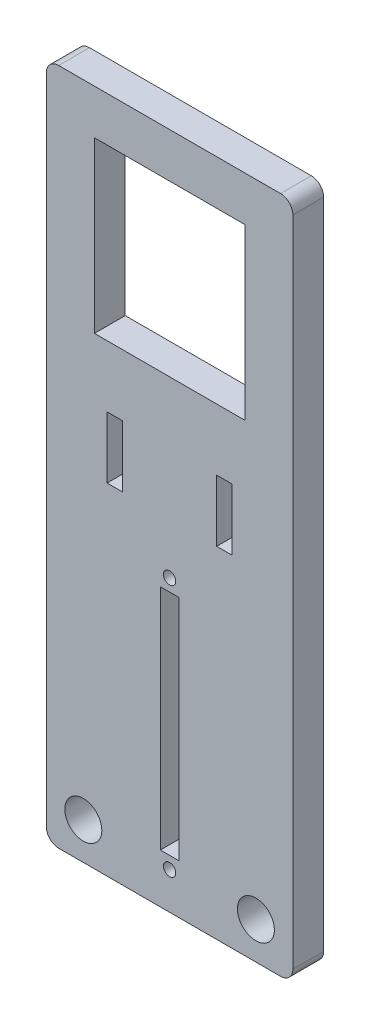
ISO-10303-21;
HEADER;
FILE_DESCRIPTION(('STEP AP214'),'2;1');
FILE_NAME('part.step','',(''),(''),'','','');
FILE_SCHEMA(('AUTOMOTIVE_DESIGN { 1 0 10303 214 1 1 1 1 }'));
ENDSEC;
DATA;
#1=APPLICATION_CONTEXT('core data for automotive mechanical design processes');
#2=APPLICATION_PROTOCOL_DEFINITION('international standard','automotive_design',2000,#1);
#3=PRODUCT_CONTEXT('',#1,'mechanical');
#4=PRODUCT('Part','Part','',(#3));
#5=PRODUCT_RELATED_PRODUCT_CATEGORY('part','',(#4));
#6=PRODUCT_DEFINITION_FORMATION('','',#4);
#7=PRODUCT_DEFINITION_CONTEXT('part definition',#1,'design');
#8=PRODUCT_DEFINITION('design','',#6,#7);
#9=PRODUCT_DEFINITION_SHAPE('','',#8);
#10=(LENGTH_UNIT() NAMED_UNIT(*) SI_UNIT(.MILLI.,.METRE.));
#11=(NAMED_UNIT(*) PLANE_ANGLE_UNIT() SI_UNIT($,.RADIAN.));
#12=(NAMED_UNIT(*) SI_UNIT($,.STERADIAN.) SOLID_ANGLE_UNIT());
#13=UNCERTAINTY_MEASURE_WITH_UNIT(LENGTH_MEASURE(1.E-05),#10,'distance_accuracy_value','');
#14=(GEOMETRIC_REPRESENTATION_CONTEXT(3) GLOBAL_UNCERTAINTY_ASSIGNED_CONTEXT((#13)) GLOBAL_UNIT_ASSIGNED_CONTEXT((#10,
#11,#12)) REPRESENTATION_CONTEXT('',''));
#15=CARTESIAN_POINT('',(0.,0.,0.));
#16=DIRECTION('',(0.,0.,1.));
#17=DIRECTION('',(1.,0.,0.));
#18=AXIS2_PLACEMENT_3D('',#15,#16,#17);
#19=CARTESIAN_POINT('',(0.,0.,5.));
#20=DIRECTION('',(0.,0.,-1.));
#21=DIRECTION('',(-1.,0.,0.));
#22=AXIS2_PLACEMENT_3D('',#19,#20,#21);
#23=PLANE('',#22);
#24=DIRECTION('',(-1.,0.,0.));
#25=VECTOR('',#24,1.);
#26=CARTESIAN_POINT('',(32.2,102.75,5.));
#27=LINE('',#26,#25);
#28=CARTESIAN_POINT('',(32.2,102.75,5.));
#29=VERTEX_POINT('',#28);
#30=CARTESIAN_POINT('',(7.8,102.75,5.));
#31=VERTEX_POINT('',#30);
#32=EDGE_CURVE('E236',#29,#31,#27,.T.);
#33=ORIENTED_EDGE('',*,*,#32,.F.);
#34=DIRECTION('',(0.,1.,0.));
#35=VECTOR('',#34,1.);
#36=CARTESIAN_POINT('',(32.2,75.25,5.));
#37=LINE('',#36,#35);
#38=CARTESIAN_POINT('',(32.2,75.25,5.));
#39=VERTEX_POINT('',#38);
#40=EDGE_CURVE('E244',#39,#29,#37,.T.);
#41=ORIENTED_EDGE('',*,*,#40,.F.);
#42=DIRECTION('',(1.,0.,0.));
#43=VECTOR('',#42,1.);
#44=CARTESIAN_POINT('',(7.8,75.25,5.));
#45=LINE('',#44,#43);
#46=CARTESIAN_POINT('',(7.8,75.25,5.));
#47=VERTEX_POINT('',#46);
#48=EDGE_CURVE('E241',#47,#39,#45,.T.);
#49=ORIENTED_EDGE('',*,*,#48,.F.);
#50=DIRECTION('',(0.,-1.,0.));
#51=VECTOR('',#50,1.);
#52=CARTESIAN_POINT('',(7.8,102.75,5.));
#53=LINE('',#52,#51);
#54=EDGE_CURVE('E238',#31,#47,#53,.T.);
#55=ORIENTED_EDGE('',*,*,#54,.F.);
#56=EDGE_LOOP('',(#33,#41,#49,#55));
#57=FACE_BOUND('',#56,.T.);
#58=DIRECTION('',(0.,-1.,0.));
#59=VECTOR('',#58,1.);
#60=CARTESIAN_POINT('',(9.86,65.25,5.));
#61=LINE('',#60,#59);
#62=CARTESIAN_POINT('',(9.86,65.25,5.));
#63=VERTEX_POINT('',#62);
#64=CARTESIAN_POINT('',(9.86,55.25,5.));
#65=VERTEX_POINT('',#64);
#66=EDGE_CURVE('E298',#63,#65,#61,.T.);
#67=ORIENTED_EDGE('',*,*,#66,.F.);
#68=DIRECTION('',(-1.,0.,0.));
#69=VECTOR('',#68,1.);
#70=CARTESIAN_POINT('',(9.86,65.25,5.));
#71=LINE('',#70,#69);
#72=CARTESIAN_POINT('',(12.36,65.25,5.));
#73=VERTEX_POINT('',#72);
#74=EDGE_CURVE('E306',#73,#63,#71,.T.);
#75=ORIENTED_EDGE('',*,*,#74,.F.);
#76=DIRECTION('',(0.,1.,0.));
#77=VECTOR('',#76,1.);
#78=CARTESIAN_POINT('',(12.36,65.25,5.));
#79=LINE('',#78,#77);
#80=CARTESIAN_POINT('',(12.36,55.25,5.));
#81=VERTEX_POINT('',#80);
#82=EDGE_CURVE('E303',#81,#73,#79,.T.);
#83=ORIENTED_EDGE('',*,*,#82,.F.);
#84=DIRECTION('',(1.,0.,0.));
#85=VECTOR('',#84,1.);
#86=CARTESIAN_POINT('',(9.86,55.25,5.));
#87=LINE('',#86,#85);
#88=EDGE_CURVE('E300',#65,#81,#87,.T.);
#89=ORIENTED_EDGE('',*,*,#88,.F.);
#90=EDGE_LOOP('',(#67,#75,#83,#89));
#91=FACE_BOUND('',#90,.T.);
#92=DIRECTION('',(0.,-1.,0.));
#93=VECTOR('',#92,1.);
#94=CARTESIAN_POINT('',(0.,0.,5.));
#95=LINE('',#94,#93);
#96=CARTESIAN_POINT('',(0.,108.,5.));
#97=VERTEX_POINT('',#96);
#98=CARTESIAN_POINT('',(0.,2.,5.));
#99=VERTEX_POINT('',#98);
#100=EDGE_CURVE('E361',#97,#99,#95,.T.);
#101=ORIENTED_EDGE('',*,*,#100,.T.);
#102=CARTESIAN_POINT('',(2.,2.,5.));
#103=DIRECTION('',(0.,0.,-1.));
#104=DIRECTION('',(-1.,0.,0.));
#105=AXIS2_PLACEMENT_3D('',#102,#103,#104);
#106=CIRCLE('',#105,2.);
#107=CARTESIAN_POINT('',(2.,0.,5.));
#108=VERTEX_POINT('',#107);
#109=EDGE_CURVE('E396',#99,#108,#106,.F.);
#110=ORIENTED_EDGE('',*,*,#109,.T.);
#111=DIRECTION('',(1.,0.,0.));
#112=VECTOR('',#111,1.);
#113=CARTESIAN_POINT('',(40.,0.,5.));
#114=LINE('',#113,#112);
#115=CARTESIAN_POINT('',(38.,0.,5.));
#116=VERTEX_POINT('',#115);
#117=EDGE_CURVE('E353',#108,#116,#114,.T.);
#118=ORIENTED_EDGE('',*,*,#117,.T.);
#119=CARTESIAN_POINT('',(38.,2.,5.));
#120=DIRECTION('',(0.,0.,-1.));
#121=DIRECTION('',(-1.,0.,0.));
#122=AXIS2_PLACEMENT_3D('',#119,#120,#121);
#123=CIRCLE('',#122,2.);
#124=CARTESIAN_POINT('',(40.,2.,5.));
#125=VERTEX_POINT('',#124);
#126=EDGE_CURVE('E394',#116,#125,#123,.F.);
#127=ORIENTED_EDGE('',*,*,#126,.T.);
#128=DIRECTION('',(0.,1.,0.));
#129=VECTOR('',#128,1.);
#130=CARTESIAN_POINT('',(40.,110.,5.));
#131=LINE('',#130,#129);
#132=CARTESIAN_POINT('',(40.,108.,5.));
#133=VERTEX_POINT('',#132);
#134=EDGE_CURVE('E356',#125,#133,#131,.T.);
#135=ORIENTED_EDGE('',*,*,#134,.T.);
#136=CARTESIAN_POINT('',(38.,108.,5.));
#137=DIRECTION('',(0.,0.,-1.));
#138=DIRECTION('',(-1.,0.,0.));
#139=AXIS2_PLACEMENT_3D('',#136,#137,#138);
#140=CIRCLE('',#139,2.);
#141=CARTESIAN_POINT('',(38.,110.,5.));
#142=VERTEX_POINT('',#141);
#143=EDGE_CURVE('E53',#133,#142,#140,.F.);
#144=ORIENTED_EDGE('',*,*,#143,.T.);
#145=DIRECTION('',(-1.,0.,0.));
#146=VECTOR('',#145,1.);
#147=CARTESIAN_POINT('',(0.,110.,5.));
#148=LINE('',#147,#146);
#149=CARTESIAN_POINT('',(1.99999999999997,110.,5.));
#150=VERTEX_POINT('',#149);
#151=EDGE_CURVE('E359',#142,#150,#148,.T.);
#152=ORIENTED_EDGE('',*,*,#151,.T.);
#153=CARTESIAN_POINT('',(1.99999999999997,108.,5.));
#154=DIRECTION('',(0.,0.,-1.));
#155=DIRECTION('',(-1.,0.,0.));
#156=AXIS2_PLACEMENT_3D('',#153,#154,#155);
#157=CIRCLE('',#156,2.);
#158=EDGE_CURVE('E392',#150,#97,#157,.F.);
#159=ORIENTED_EDGE('',*,*,#158,.T.);
#160=EDGE_LOOP('',(#101,#110,#118,#127,#135,#144,#152,#159));
#161=FACE_BOUND('',#160,.T.);
#162=CARTESIAN_POINT('',(34.,6.,5.));
#163=DIRECTION('',(0.,0.,1.));
#164=DIRECTION('',(1.,0.,0.));
#165=AXIS2_PLACEMENT_3D('',#162,#163,#164);
#166=CIRCLE('',#165,3.);
#167=CARTESIAN_POINT('',(37.,6.,5.));
#168=VERTEX_POINT('',#167);
#169=EDGE_CURVE('E347',#168,#168,#166,.T.);
#170=ORIENTED_EDGE('',*,*,#169,.F.);
#171=EDGE_LOOP('',(#170));
#172=FACE_BOUND('',#171,.T.);
#173=CARTESIAN_POINT('',(6.,6.,5.));
#174=DIRECTION('',(0.,0.,1.));
#175=DIRECTION('',(1.,0.,0.));
#176=AXIS2_PLACEMENT_3D('',#173,#174,#175);
#177=CIRCLE('',#176,3.);
#178=CARTESIAN_POINT('',(9.00000000000001,6.,5.));
#179=VERTEX_POINT('',#178);
#180=EDGE_CURVE('E341',#179,#179,#177,.T.);
#181=ORIENTED_EDGE('',*,*,#180,.F.);
#182=EDGE_LOOP('',(#181));
#183=FACE_BOUND('',#182,.T.);
#184=CARTESIAN_POINT('',(20.,6.,5.));
#185=DIRECTION('',(0.,0.,1.));
#186=DIRECTION('',(1.,0.,0.));
#187=AXIS2_PLACEMENT_3D('',#184,#185,#186);
#188=CIRCLE('',#187,1.00000000000003);
#189=CARTESIAN_POINT('',(21.,6.,5.));
#190=VERTEX_POINT('',#189);
#191=EDGE_CURVE('E335',#190,#190,#188,.T.);
#192=ORIENTED_EDGE('',*,*,#191,.F.);
#193=EDGE_LOOP('',(#192));
#194=FACE_BOUND('',#193,.T.);
#195=CARTESIAN_POINT('',(20.,47.,5.));
#196=DIRECTION('',(0.,0.,1.));
#197=DIRECTION('',(1.,0.,0.));
#198=AXIS2_PLACEMENT_3D('',#195,#196,#197);
#199=CIRCLE('',#198,1.00000000000001);
#200=CARTESIAN_POINT('',(21.,47.,5.));
#201=VERTEX_POINT('',#200);
#202=EDGE_CURVE('E329',#201,#201,#199,.T.);
#203=ORIENTED_EDGE('',*,*,#202,.F.);
#204=EDGE_LOOP('',(#203));
#205=FACE_BOUND('',#204,.T.);
#206=DIRECTION('',(-1.,0.,0.));
#207=VECTOR('',#206,1.);
#208=CARTESIAN_POINT('',(21.5,45.,5.));
#209=LINE('',#208,#207);
#210=CARTESIAN_POINT('',(21.5,45.,5.));
#211=VERTEX_POINT('',#210);
#212=CARTESIAN_POINT('',(18.5,45.,5.));
#213=VERTEX_POINT('',#212);
#214=EDGE_CURVE('E267',#211,#213,#209,.T.);
#215=ORIENTED_EDGE('',*,*,#214,.F.);
#216=DIRECTION('',(0.,1.,0.));
#217=VECTOR('',#216,1.);
#218=CARTESIAN_POINT('',(21.5,8.,5.));
#219=LINE('',#218,#217);
#220=CARTESIAN_POINT('',(21.5,8.,5.));
#221=VERTEX_POINT('',#220);
#222=EDGE_CURVE('E275',#221,#211,#219,.T.);
#223=ORIENTED_EDGE('',*,*,#222,.F.);
#224=DIRECTION('',(1.,0.,0.));
#225=VECTOR('',#224,1.);
#226=CARTESIAN_POINT('',(18.5,8.,5.));
#227=LINE('',#226,#225);
#228=CARTESIAN_POINT('',(18.5,8.,5.));
#229=VERTEX_POINT('',#228);
#230=EDGE_CURVE('E272',#229,#221,#227,.T.);
#231=ORIENTED_EDGE('',*,*,#230,.F.);
#232=DIRECTION('',(0.,-1.,0.));
#233=VECTOR('',#232,1.);
#234=CARTESIAN_POINT('',(18.5,45.,5.));
#235=LINE('',#234,#233);
#236=EDGE_CURVE('E269',#213,#229,#235,.T.);
#237=ORIENTED_EDGE('',*,*,#236,.F.);
#238=EDGE_LOOP('',(#215,#223,#231,#237));
#239=FACE_BOUND('',#238,.T.);
#240=DIRECTION('',(0.,-1.,0.));
#241=VECTOR('',#240,1.);
#242=CARTESIAN_POINT('',(27.64,65.25,5.));
#243=LINE('',#242,#241);
#244=CARTESIAN_POINT('',(27.64,65.25,5.));
#245=VERTEX_POINT('',#244);
#246=CARTESIAN_POINT('',(27.64,55.25,5.));
#247=VERTEX_POINT('',#246);
#248=EDGE_CURVE('E195',#245,#247,#243,.T.);
#249=ORIENTED_EDGE('',*,*,#248,.F.);
#250=DIRECTION('',(-1.,0.,0.));
#251=VECTOR('',#250,1.);
#252=CARTESIAN_POINT('',(27.64,65.25,5.));
#253=LINE('',#252,#251);
#254=CARTESIAN_POINT('',(30.14,65.25,5.));
#255=VERTEX_POINT('',#254);
#256=EDGE_CURVE('E220',#255,#245,#253,.T.);
#257=ORIENTED_EDGE('',*,*,#256,.F.);
#258=DIRECTION('',(0.,1.,0.));
#259=VECTOR('',#258,1.);
#260=CARTESIAN_POINT('',(30.14,65.25,5.));
#261=LINE('',#260,#259);
#262=CARTESIAN_POINT('',(30.14,55.25,5.));
#263=VERTEX_POINT('',#262);
#264=EDGE_CURVE('E218',#263,#255,#261,.T.);
#265=ORIENTED_EDGE('',*,*,#264,.F.);
#266=DIRECTION('',(1.,0.,0.));
#267=VECTOR('',#266,1.);
#268=CARTESIAN_POINT('',(27.64,55.25,5.));
#269=LINE('',#268,#267);
#270=EDGE_CURVE('E205',#247,#263,#269,.T.);
#271=ORIENTED_EDGE('',*,*,#270,.F.);
#272=EDGE_LOOP('',(#249,#257,#265,#271));
#273=FACE_BOUND('',#272,.T.);
#274=ADVANCED_FACE('F33',(#57,#91,#161,#172,#183,#194,#205,#239,#273),#23,.F.);
#275=CARTESIAN_POINT('',(0.,0.,0.));
#276=DIRECTION('',(0.,0.,-1.));
#277=DIRECTION('',(-1.,0.,0.));
#278=AXIS2_PLACEMENT_3D('',#275,#276,#277);
#279=PLANE('',#278);
#280=CARTESIAN_POINT('',(20.,6.,0.));
#281=DIRECTION('',(0.,0.,1.));
#282=DIRECTION('',(1.,0.,0.));
#283=AXIS2_PLACEMENT_3D('',#280,#281,#282);
#284=CIRCLE('',#283,1.00000000000003);
#285=CARTESIAN_POINT('',(21.,6.,0.));
#286=VERTEX_POINT('',#285);
#287=EDGE_CURVE('E332',#286,#286,#284,.T.);
#288=ORIENTED_EDGE('',*,*,#287,.T.);
#289=EDGE_LOOP('',(#288));
#290=FACE_BOUND('',#289,.T.);
#291=CARTESIAN_POINT('',(34.,6.,0.));
#292=DIRECTION('',(0.,0.,1.));
#293=DIRECTION('',(1.,0.,0.));
#294=AXIS2_PLACEMENT_3D('',#291,#292,#293);
#295=CIRCLE('',#294,3.);
#296=CARTESIAN_POINT('',(37.,6.,0.));
#297=VERTEX_POINT('',#296);
#298=EDGE_CURVE('E344',#297,#297,#295,.T.);
#299=ORIENTED_EDGE('',*,*,#298,.T.);
#300=EDGE_LOOP('',(#299));
#301=FACE_BOUND('',#300,.T.);
#302=DIRECTION('',(1.,0.,0.));
#303=VECTOR('',#302,1.);
#304=CARTESIAN_POINT('',(40.,0.,0.));
#305=LINE('',#304,#303);
#306=CARTESIAN_POINT('',(2.,0.,0.));
#307=VERTEX_POINT('',#306);
#308=CARTESIAN_POINT('',(38.,0.,0.));
#309=VERTEX_POINT('',#308);
#310=EDGE_CURVE('E350',#307,#309,#305,.T.);
#311=ORIENTED_EDGE('',*,*,#310,.F.);
#312=CARTESIAN_POINT('',(2.,2.,0.));
#313=DIRECTION('',(0.,0.,-1.));
#314=DIRECTION('',(-1.,0.,0.));
#315=AXIS2_PLACEMENT_3D('',#312,#313,#314);
#316=CIRCLE('',#315,2.);
#317=CARTESIAN_POINT('',(0.,2.,0.));
#318=VERTEX_POINT('',#317);
#319=EDGE_CURVE('E384',#307,#318,#316,.T.);
#320=ORIENTED_EDGE('',*,*,#319,.T.);
#321=DIRECTION('',(0.,-1.,0.));
#322=VECTOR('',#321,1.);
#323=CARTESIAN_POINT('',(0.,0.,0.));
#324=LINE('',#323,#322);
#325=CARTESIAN_POINT('',(0.,108.,0.));
#326=VERTEX_POINT('',#325);
#327=EDGE_CURVE('E357',#326,#318,#324,.T.);
#328=ORIENTED_EDGE('',*,*,#327,.F.);
#329=CARTESIAN_POINT('',(1.99999999999997,108.,0.));
#330=DIRECTION('',(0.,0.,-1.));
#331=DIRECTION('',(-1.,0.,0.));
#332=AXIS2_PLACEMENT_3D('',#329,#330,#331);
#333=CIRCLE('',#332,2.);
#334=CARTESIAN_POINT('',(1.99999999999997,110.,0.));
#335=VERTEX_POINT('',#334);
#336=EDGE_CURVE('E380',#326,#335,#333,.T.);
#337=ORIENTED_EDGE('',*,*,#336,.T.);
#338=DIRECTION('',(-1.,0.,0.));
#339=VECTOR('',#338,1.);
#340=CARTESIAN_POINT('',(0.,110.,0.));
#341=LINE('',#340,#339);
#342=CARTESIAN_POINT('',(38.,110.,0.));
#343=VERTEX_POINT('',#342);
#344=EDGE_CURVE('E370',#343,#335,#341,.T.);
#345=ORIENTED_EDGE('',*,*,#344,.F.);
#346=CARTESIAN_POINT('',(38.,108.,0.));
#347=DIRECTION('',(0.,0.,-1.));
#348=DIRECTION('',(-1.,0.,0.));
#349=AXIS2_PLACEMENT_3D('',#346,#347,#348);
#350=CIRCLE('',#349,2.);
#351=CARTESIAN_POINT('',(40.,108.,0.));
#352=VERTEX_POINT('',#351);
#353=EDGE_CURVE('E378',#343,#352,#350,.T.);
#354=ORIENTED_EDGE('',*,*,#353,.T.);
#355=DIRECTION('',(0.,1.,0.));
#356=VECTOR('',#355,1.);
#357=CARTESIAN_POINT('',(40.,110.,0.));
#358=LINE('',#357,#356);
#359=CARTESIAN_POINT('',(40.,2.,0.));
#360=VERTEX_POINT('',#359);
#361=EDGE_CURVE('E367',#360,#352,#358,.T.);
#362=ORIENTED_EDGE('',*,*,#361,.F.);
#363=CARTESIAN_POINT('',(38.,2.,0.));
#364=DIRECTION('',(0.,0.,-1.));
#365=DIRECTION('',(-1.,0.,0.));
#366=AXIS2_PLACEMENT_3D('',#363,#364,#365);
#367=CIRCLE('',#366,2.);
#368=EDGE_CURVE('E382',#360,#309,#367,.T.);
#369=ORIENTED_EDGE('',*,*,#368,.T.);
#370=EDGE_LOOP('',(#311,#320,#328,#337,#345,#354,#362,#369));
#371=FACE_BOUND('',#370,.T.);
#372=CARTESIAN_POINT('',(6.,6.,0.));
#373=DIRECTION('',(0.,0.,1.));
#374=DIRECTION('',(1.,0.,0.));
#375=AXIS2_PLACEMENT_3D('',#372,#373,#374);
#376=CIRCLE('',#375,3.);
#377=CARTESIAN_POINT('',(9.00000000000001,6.,0.));
#378=VERTEX_POINT('',#377);
#379=EDGE_CURVE('E338',#378,#378,#376,.T.);
#380=ORIENTED_EDGE('',*,*,#379,.T.);
#381=EDGE_LOOP('',(#380));
#382=FACE_BOUND('',#381,.T.);
#383=CARTESIAN_POINT('',(20.,47.,0.));
#384=DIRECTION('',(0.,0.,1.));
#385=DIRECTION('',(1.,0.,0.));
#386=AXIS2_PLACEMENT_3D('',#383,#384,#385);
#387=CIRCLE('',#386,1.00000000000001);
#388=CARTESIAN_POINT('',(21.,47.,0.));
#389=VERTEX_POINT('',#388);
#390=EDGE_CURVE('E328',#389,#389,#387,.T.);
#391=ORIENTED_EDGE('',*,*,#390,.T.);
#392=EDGE_LOOP('',(#391));
#393=FACE_BOUND('',#392,.T.);
#394=DIRECTION('',(-1.,0.,0.));
#395=VECTOR('',#394,1.);
#396=CARTESIAN_POINT('',(9.86,65.25,0.));
#397=LINE('',#396,#395);
#398=CARTESIAN_POINT('',(12.36,65.25,0.));
#399=VERTEX_POINT('',#398);
#400=CARTESIAN_POINT('',(9.86,65.25,0.));
#401=VERTEX_POINT('',#400);
#402=EDGE_CURVE('E301',#399,#401,#397,.T.);
#403=ORIENTED_EDGE('',*,*,#402,.T.);
#404=DIRECTION('',(0.,-1.,0.));
#405=VECTOR('',#404,1.);
#406=CARTESIAN_POINT('',(9.86,65.25,0.));
#407=LINE('',#406,#405);
#408=CARTESIAN_POINT('',(9.86,55.25,0.));
#409=VERTEX_POINT('',#408);
#410=EDGE_CURVE('E297',#401,#409,#407,.T.);
#411=ORIENTED_EDGE('',*,*,#410,.T.);
#412=DIRECTION('',(1.,0.,0.));
#413=VECTOR('',#412,1.);
#414=CARTESIAN_POINT('',(9.86,55.25,0.));
#415=LINE('',#414,#413);
#416=CARTESIAN_POINT('',(12.36,55.25,0.));
#417=VERTEX_POINT('',#416);
#418=EDGE_CURVE('E311',#409,#417,#415,.T.);
#419=ORIENTED_EDGE('',*,*,#418,.T.);
#420=DIRECTION('',(0.,1.,0.));
#421=VECTOR('',#420,1.);
#422=CARTESIAN_POINT('',(12.36,65.25,0.));
#423=LINE('',#422,#421);
#424=EDGE_CURVE('E314',#417,#399,#423,.T.);
#425=ORIENTED_EDGE('',*,*,#424,.T.);
#426=EDGE_LOOP('',(#403,#411,#419,#425));
#427=FACE_BOUND('',#426,.T.);
#428=DIRECTION('',(0.,1.,0.));
#429=VECTOR('',#428,1.);
#430=CARTESIAN_POINT('',(21.5,8.,0.));
#431=LINE('',#430,#429);
#432=CARTESIAN_POINT('',(21.5,8.,0.));
#433=VERTEX_POINT('',#432);
#434=CARTESIAN_POINT('',(21.5,45.,0.));
#435=VERTEX_POINT('',#434);
#436=EDGE_CURVE('E270',#433,#435,#431,.T.);
#437=ORIENTED_EDGE('',*,*,#436,.T.);
#438=DIRECTION('',(-1.,0.,0.));
#439=VECTOR('',#438,1.);
#440=CARTESIAN_POINT('',(21.5,45.,0.));
#441=LINE('',#440,#439);
#442=CARTESIAN_POINT('',(18.5,45.,0.));
#443=VERTEX_POINT('',#442);
#444=EDGE_CURVE('E266',#435,#443,#441,.T.);
#445=ORIENTED_EDGE('',*,*,#444,.T.);
#446=DIRECTION('',(0.,-1.,0.));
#447=VECTOR('',#446,1.);
#448=CARTESIAN_POINT('',(18.5,45.,0.));
#449=LINE('',#448,#447);
#450=CARTESIAN_POINT('',(18.5,8.,0.));
#451=VERTEX_POINT('',#450);
#452=EDGE_CURVE('E280',#443,#451,#449,.T.);
#453=ORIENTED_EDGE('',*,*,#452,.T.);
#454=DIRECTION('',(1.,0.,0.));
#455=VECTOR('',#454,1.);
#456=CARTESIAN_POINT('',(18.5,8.,0.));
#457=LINE('',#456,#455);
#458=EDGE_CURVE('E283',#451,#433,#457,.T.);
#459=ORIENTED_EDGE('',*,*,#458,.T.);
#460=EDGE_LOOP('',(#437,#445,#453,#459));
#461=FACE_BOUND('',#460,.T.);
#462=DIRECTION('',(0.,1.,0.));
#463=VECTOR('',#462,1.);
#464=CARTESIAN_POINT('',(32.2,75.25,0.));
#465=LINE('',#464,#463);
#466=CARTESIAN_POINT('',(32.2,75.25,0.));
#467=VERTEX_POINT('',#466);
#468=CARTESIAN_POINT('',(32.2,102.75,0.));
#469=VERTEX_POINT('',#468);
#470=EDGE_CURVE('E239',#467,#469,#465,.T.);
#471=ORIENTED_EDGE('',*,*,#470,.T.);
#472=DIRECTION('',(-1.,0.,0.));
#473=VECTOR('',#472,1.);
#474=CARTESIAN_POINT('',(32.2,102.75,0.));
#475=LINE('',#474,#473);
#476=CARTESIAN_POINT('',(7.8,102.75,0.));
#477=VERTEX_POINT('',#476);
#478=EDGE_CURVE('E213',#469,#477,#475,.T.);
#479=ORIENTED_EDGE('',*,*,#478,.T.);
#480=DIRECTION('',(0.,-1.,0.));
#481=VECTOR('',#480,1.);
#482=CARTESIAN_POINT('',(7.8,102.75,0.));
#483=LINE('',#482,#481);
#484=CARTESIAN_POINT('',(7.8,75.25,0.));
#485=VERTEX_POINT('',#484);
#486=EDGE_CURVE('E249',#477,#485,#483,.T.);
#487=ORIENTED_EDGE('',*,*,#486,.T.);
#488=DIRECTION('',(1.,0.,0.));
#489=VECTOR('',#488,1.);
#490=CARTESIAN_POINT('',(7.8,75.25,0.));
#491=LINE('',#490,#489);
#492=EDGE_CURVE('E252',#485,#467,#491,.T.);
#493=ORIENTED_EDGE('',*,*,#492,.T.);
#494=EDGE_LOOP('',(#471,#479,#487,#493));
#495=FACE_BOUND('',#494,.T.);
#496=DIRECTION('',(-1.,0.,0.));
#497=VECTOR('',#496,1.);
#498=CARTESIAN_POINT('',(27.64,65.25,0.));
#499=LINE('',#498,#497);
#500=CARTESIAN_POINT('',(30.14,65.25,0.));
#501=VERTEX_POINT('',#500);
#502=CARTESIAN_POINT('',(27.64,65.25,0.));
#503=VERTEX_POINT('',#502);
#504=EDGE_CURVE('E206',#501,#503,#499,.T.);
#505=ORIENTED_EDGE('',*,*,#504,.T.);
#506=DIRECTION('',(0.,-1.,0.));
#507=VECTOR('',#506,1.);
#508=CARTESIAN_POINT('',(27.64,65.25,0.));
#509=LINE('',#508,#507);
#510=CARTESIAN_POINT('',(27.64,55.25,0.));
#511=VERTEX_POINT('',#510);
#512=EDGE_CURVE('E224',#503,#511,#509,.T.);
#513=ORIENTED_EDGE('',*,*,#512,.T.);
#514=DIRECTION('',(1.,0.,0.));
#515=VECTOR('',#514,1.);
#516=CARTESIAN_POINT('',(27.64,55.25,0.));
#517=LINE('',#516,#515);
#518=CARTESIAN_POINT('',(30.14,55.25,0.));
#519=VERTEX_POINT('',#518);
#520=EDGE_CURVE('E212',#511,#519,#517,.T.);
#521=ORIENTED_EDGE('',*,*,#520,.T.);
#522=DIRECTION('',(0.,1.,0.));
#523=VECTOR('',#522,1.);
#524=CARTESIAN_POINT('',(30.14,65.25,0.));
#525=LINE('',#524,#523);
#526=EDGE_CURVE('E227',#519,#501,#525,.T.);
#527=ORIENTED_EDGE('',*,*,#526,.T.);
#528=EDGE_LOOP('',(#505,#513,#521,#527));
#529=FACE_BOUND('',#528,.T.);
#530=ADVANCED_FACE('F409',(#290,#301,#371,#382,#393,#427,#461,#495,#529),#279,.T.);
#531=CARTESIAN_POINT('',(40.,0.,5.));
#532=DIRECTION('',(0.,1.,0.));
#533=DIRECTION('',(-1.,0.,0.));
#534=AXIS2_PLACEMENT_3D('',#531,#532,#533);
#535=PLANE('',#534);
#536=ORIENTED_EDGE('',*,*,#117,.F.);
#537=DIRECTION('',(0.,0.,-1.));
#538=VECTOR('',#537,1.);
#539=CARTESIAN_POINT('',(2.,0.,5.));
#540=LINE('',#539,#538);
#541=EDGE_CURVE('E375',#108,#307,#540,.T.);
#542=ORIENTED_EDGE('',*,*,#541,.T.);
#543=ORIENTED_EDGE('',*,*,#310,.T.);
#544=DIRECTION('',(0.,0.,-1.));
#545=VECTOR('',#544,1.);
#546=CARTESIAN_POINT('',(38.,0.,5.));
#547=LINE('',#546,#545);
#548=EDGE_CURVE('E364',#309,#116,#547,.F.);
#549=ORIENTED_EDGE('',*,*,#548,.T.);
#550=EDGE_LOOP('',(#536,#542,#543,#549));
#551=FACE_BOUND('',#550,.T.);
#552=ADVANCED_FACE('F428',(#551),#535,.F.);
#553=CARTESIAN_POINT('',(40.,110.,5.));
#554=DIRECTION('',(-1.,0.,0.));
#555=DIRECTION('',(0.,-1.,0.));
#556=AXIS2_PLACEMENT_3D('',#553,#554,#555);
#557=PLANE('',#556);
#558=ORIENTED_EDGE('',*,*,#134,.F.);
#559=DIRECTION('',(0.,0.,-1.));
#560=VECTOR('',#559,1.);
#561=CARTESIAN_POINT('',(40.,2.,5.));
#562=LINE('',#561,#560);
#563=EDGE_CURVE('E400',#125,#360,#562,.T.);
#564=ORIENTED_EDGE('',*,*,#563,.T.);
#565=ORIENTED_EDGE('',*,*,#361,.T.);
#566=DIRECTION('',(0.,0.,-1.));
#567=VECTOR('',#566,1.);
#568=CARTESIAN_POINT('',(40.,108.,5.));
#569=LINE('',#568,#567);
#570=EDGE_CURVE('E398',#352,#133,#569,.F.);
#571=ORIENTED_EDGE('',*,*,#570,.T.);
#572=EDGE_LOOP('',(#558,#564,#565,#571));
#573=FACE_BOUND('',#572,.T.);
#574=ADVANCED_FACE('F436',(#573),#557,.F.);
#575=CARTESIAN_POINT('',(0.,110.,5.));
#576=DIRECTION('',(0.,-1.,0.));
#577=DIRECTION('',(0.,0.,-1.));
#578=AXIS2_PLACEMENT_3D('',#575,#576,#577);
#579=PLANE('',#578);
#580=ORIENTED_EDGE('',*,*,#344,.T.);
#581=DIRECTION('',(0.,0.,-1.));
#582=VECTOR('',#581,1.);
#583=CARTESIAN_POINT('',(1.99999999999997,110.,5.));
#584=LINE('',#583,#582);
#585=EDGE_CURVE('E11',#335,#150,#584,.F.);
#586=ORIENTED_EDGE('',*,*,#585,.T.);
#587=ORIENTED_EDGE('',*,*,#151,.F.);
#588=DIRECTION('',(0.,0.,-1.));
#589=VECTOR('',#588,1.);
#590=CARTESIAN_POINT('',(38.,110.,5.));
#591=LINE('',#590,#589);
#592=EDGE_CURVE('E41',#142,#343,#591,.T.);
#593=ORIENTED_EDGE('',*,*,#592,.T.);
#594=EDGE_LOOP('',(#580,#586,#587,#593));
#595=FACE_BOUND('',#594,.T.);
#596=ADVANCED_FACE('F405',(#595),#579,.F.);
#597=CARTESIAN_POINT('',(0.,0.,5.));
#598=DIRECTION('',(1.,0.,0.));
#599=DIRECTION('',(0.,1.,0.));
#600=AXIS2_PLACEMENT_3D('',#597,#598,#599);
#601=PLANE('',#600);
#602=ORIENTED_EDGE('',*,*,#327,.T.);
#603=DIRECTION('',(0.,0.,-1.));
#604=VECTOR('',#603,1.);
#605=CARTESIAN_POINT('',(0.,2.,5.));
#606=LINE('',#605,#604);
#607=EDGE_CURVE('E389',#318,#99,#606,.F.);
#608=ORIENTED_EDGE('',*,*,#607,.T.);
#609=ORIENTED_EDGE('',*,*,#100,.F.);
#610=DIRECTION('',(0.,0.,-1.));
#611=VECTOR('',#610,1.);
#612=CARTESIAN_POINT('',(0.,108.,5.));
#613=LINE('',#612,#611);
#614=EDGE_CURVE('E386',#97,#326,#613,.T.);
#615=ORIENTED_EDGE('',*,*,#614,.T.);
#616=EDGE_LOOP('',(#602,#608,#609,#615));
#617=FACE_BOUND('',#616,.T.);
#618=ADVANCED_FACE('F419',(#617),#601,.F.);
#619=CARTESIAN_POINT('',(34.,6.,5.));
#620=DIRECTION('',(0.,0.,-1.));
#621=DIRECTION('',(-1.,0.,0.));
#622=AXIS2_PLACEMENT_3D('',#619,#620,#621);
#623=CYLINDRICAL_SURFACE('',#622,3.);
#624=ORIENTED_EDGE('',*,*,#169,.T.);
#625=EDGE_LOOP('',(#624));
#626=FACE_BOUND('',#625,.T.);
#627=ORIENTED_EDGE('',*,*,#298,.F.);
#628=EDGE_LOOP('',(#627));
#629=FACE_BOUND('',#628,.T.);
#630=ADVANCED_FACE('F453',(#626,#629),#623,.F.);
#631=CARTESIAN_POINT('',(6.,6.,5.));
#632=DIRECTION('',(0.,0.,-1.));
#633=DIRECTION('',(-1.,0.,0.));
#634=AXIS2_PLACEMENT_3D('',#631,#632,#633);
#635=CYLINDRICAL_SURFACE('',#634,3.);
#636=ORIENTED_EDGE('',*,*,#180,.T.);
#637=EDGE_LOOP('',(#636));
#638=FACE_BOUND('',#637,.T.);
#639=ORIENTED_EDGE('',*,*,#379,.F.);
#640=EDGE_LOOP('',(#639));
#641=FACE_BOUND('',#640,.T.);
#642=ADVANCED_FACE('F646',(#638,#641),#635,.F.);
#643=CARTESIAN_POINT('',(20.,6.,5.));
#644=DIRECTION('',(0.,0.,-1.));
#645=DIRECTION('',(-1.,0.,0.));
#646=AXIS2_PLACEMENT_3D('',#643,#644,#645);
#647=CYLINDRICAL_SURFACE('',#646,1.00000000000003);
#648=ORIENTED_EDGE('',*,*,#191,.T.);
#649=EDGE_LOOP('',(#648));
#650=FACE_BOUND('',#649,.T.);
#651=ORIENTED_EDGE('',*,*,#287,.F.);
#652=EDGE_LOOP('',(#651));
#653=FACE_BOUND('',#652,.T.);
#654=ADVANCED_FACE('F637',(#650,#653),#647,.F.);
#655=CARTESIAN_POINT('',(20.,47.,5.));
#656=DIRECTION('',(0.,0.,-1.));
#657=DIRECTION('',(-1.,0.,0.));
#658=AXIS2_PLACEMENT_3D('',#655,#656,#657);
#659=CYLINDRICAL_SURFACE('',#658,1.00000000000001);
#660=ORIENTED_EDGE('',*,*,#202,.T.);
#661=EDGE_LOOP('',(#660));
#662=FACE_BOUND('',#661,.T.);
#663=ORIENTED_EDGE('',*,*,#390,.F.);
#664=EDGE_LOOP('',(#663));
#665=FACE_BOUND('',#664,.T.);
#666=ADVANCED_FACE('F628',(#662,#665),#659,.F.);
#667=CARTESIAN_POINT('',(9.86,65.25,5.));
#668=DIRECTION('',(1.,0.,0.));
#669=DIRECTION('',(0.,1.,0.));
#670=AXIS2_PLACEMENT_3D('',#667,#668,#669);
#671=PLANE('',#670);
#672=ORIENTED_EDGE('',*,*,#410,.F.);
#673=DIRECTION('',(0.,0.,-1.));
#674=VECTOR('',#673,1.);
#675=CARTESIAN_POINT('',(9.86,65.25,5.));
#676=LINE('',#675,#674);
#677=EDGE_CURVE('E308',#63,#401,#676,.T.);
#678=ORIENTED_EDGE('',*,*,#677,.F.);
#679=ORIENTED_EDGE('',*,*,#66,.T.);
#680=DIRECTION('',(0.,0.,-1.));
#681=VECTOR('',#680,1.);
#682=CARTESIAN_POINT('',(9.86,55.25,5.));
#683=LINE('',#682,#681);
#684=EDGE_CURVE('E325',#65,#409,#683,.T.);
#685=ORIENTED_EDGE('',*,*,#684,.T.);
#686=EDGE_LOOP('',(#672,#678,#679,#685));
#687=FACE_BOUND('',#686,.T.);
#688=ADVANCED_FACE('F619',(#687),#671,.T.);
#689=CARTESIAN_POINT('',(9.86,55.25,5.));
#690=DIRECTION('',(0.,1.,0.));
#691=DIRECTION('',(0.,0.,1.));
#692=AXIS2_PLACEMENT_3D('',#689,#690,#691);
#693=PLANE('',#692);
#694=ORIENTED_EDGE('',*,*,#418,.F.);
#695=ORIENTED_EDGE('',*,*,#684,.F.);
#696=ORIENTED_EDGE('',*,*,#88,.T.);
#697=DIRECTION('',(0.,0.,-1.));
#698=VECTOR('',#697,1.);
#699=CARTESIAN_POINT('',(12.36,55.25,5.));
#700=LINE('',#699,#698);
#701=EDGE_CURVE('E323',#81,#417,#700,.T.);
#702=ORIENTED_EDGE('',*,*,#701,.T.);
#703=EDGE_LOOP('',(#694,#695,#696,#702));
#704=FACE_BOUND('',#703,.T.);
#705=ADVANCED_FACE('F610',(#704),#693,.T.);
#706=CARTESIAN_POINT('',(12.36,65.25,5.));
#707=DIRECTION('',(-1.,0.,0.));
#708=DIRECTION('',(0.,-1.,0.));
#709=AXIS2_PLACEMENT_3D('',#706,#707,#708);
#710=PLANE('',#709);
#711=ORIENTED_EDGE('',*,*,#424,.F.);
#712=ORIENTED_EDGE('',*,*,#701,.F.);
#713=ORIENTED_EDGE('',*,*,#82,.T.);
#714=DIRECTION('',(0.,0.,-1.));
#715=VECTOR('',#714,1.);
#716=CARTESIAN_POINT('',(12.36,65.25,5.));
#717=LINE('',#716,#715);
#718=EDGE_CURVE('E321',#73,#399,#717,.T.);
#719=ORIENTED_EDGE('',*,*,#718,.T.);
#720=EDGE_LOOP('',(#711,#712,#713,#719));
#721=FACE_BOUND('',#720,.T.);
#722=ADVANCED_FACE('F601',(#721),#710,.T.);
#723=CARTESIAN_POINT('',(9.86,65.25,5.));
#724=DIRECTION('',(0.,-1.,0.));
#725=DIRECTION('',(1.,0.,0.));
#726=AXIS2_PLACEMENT_3D('',#723,#724,#725);
#727=PLANE('',#726);
#728=ORIENTED_EDGE('',*,*,#402,.F.);
#729=ORIENTED_EDGE('',*,*,#718,.F.);
#730=ORIENTED_EDGE('',*,*,#74,.T.);
#731=ORIENTED_EDGE('',*,*,#677,.T.);
#732=EDGE_LOOP('',(#728,#729,#730,#731));
#733=FACE_BOUND('',#732,.T.);
#734=ADVANCED_FACE('F592',(#733),#727,.T.);
#735=CARTESIAN_POINT('',(21.5,45.,5.));
#736=DIRECTION('',(0.,-1.,0.));
#737=DIRECTION('',(0.,0.,-1.));
#738=AXIS2_PLACEMENT_3D('',#735,#736,#737);
#739=PLANE('',#738);
#740=ORIENTED_EDGE('',*,*,#444,.F.);
#741=DIRECTION('',(0.,0.,-1.));
#742=VECTOR('',#741,1.);
#743=CARTESIAN_POINT('',(21.5,45.,5.));
#744=LINE('',#743,#742);
#745=EDGE_CURVE('E277',#211,#435,#744,.T.);
#746=ORIENTED_EDGE('',*,*,#745,.F.);
#747=ORIENTED_EDGE('',*,*,#214,.T.);
#748=DIRECTION('',(0.,0.,-1.));
#749=VECTOR('',#748,1.);
#750=CARTESIAN_POINT('',(18.5,45.,5.));
#751=LINE('',#750,#749);
#752=EDGE_CURVE('E294',#213,#443,#751,.T.);
#753=ORIENTED_EDGE('',*,*,#752,.T.);
#754=EDGE_LOOP('',(#740,#746,#747,#753));
#755=FACE_BOUND('',#754,.T.);
#756=ADVANCED_FACE('F583',(#755),#739,.T.);
#757=CARTESIAN_POINT('',(18.5,45.,5.));
#758=DIRECTION('',(1.,0.,0.));
#759=DIRECTION('',(0.,0.,-1.));
#760=AXIS2_PLACEMENT_3D('',#757,#758,#759);
#761=PLANE('',#760);
#762=ORIENTED_EDGE('',*,*,#452,.F.);
#763=ORIENTED_EDGE('',*,*,#752,.F.);
#764=ORIENTED_EDGE('',*,*,#236,.T.);
#765=DIRECTION('',(0.,0.,-1.));
#766=VECTOR('',#765,1.);
#767=CARTESIAN_POINT('',(18.5,8.,5.));
#768=LINE('',#767,#766);
#769=EDGE_CURVE('E292',#229,#451,#768,.T.);
#770=ORIENTED_EDGE('',*,*,#769,.T.);
#771=EDGE_LOOP('',(#762,#763,#764,#770));
#772=FACE_BOUND('',#771,.T.);
#773=ADVANCED_FACE('F574',(#772),#761,.T.);
#774=CARTESIAN_POINT('',(18.5,8.,5.));
#775=DIRECTION('',(0.,1.,0.));
#776=DIRECTION('',(0.,0.,1.));
#777=AXIS2_PLACEMENT_3D('',#774,#775,#776);
#778=PLANE('',#777);
#779=ORIENTED_EDGE('',*,*,#458,.F.);
#780=ORIENTED_EDGE('',*,*,#769,.F.);
#781=ORIENTED_EDGE('',*,*,#230,.T.);
#782=DIRECTION('',(0.,0.,-1.));
#783=VECTOR('',#782,1.);
#784=CARTESIAN_POINT('',(21.5,8.,5.));
#785=LINE('',#784,#783);
#786=EDGE_CURVE('E290',#221,#433,#785,.T.);
#787=ORIENTED_EDGE('',*,*,#786,.T.);
#788=EDGE_LOOP('',(#779,#780,#781,#787));
#789=FACE_BOUND('',#788,.T.);
#790=ADVANCED_FACE('F565',(#789),#778,.T.);
#791=CARTESIAN_POINT('',(21.5,8.,5.));
#792=DIRECTION('',(-1.,0.,0.));
#793=DIRECTION('',(0.,0.,1.));
#794=AXIS2_PLACEMENT_3D('',#791,#792,#793);
#795=PLANE('',#794);
#796=ORIENTED_EDGE('',*,*,#436,.F.);
#797=ORIENTED_EDGE('',*,*,#786,.F.);
#798=ORIENTED_EDGE('',*,*,#222,.T.);
#799=ORIENTED_EDGE('',*,*,#745,.T.);
#800=EDGE_LOOP('',(#796,#797,#798,#799));
#801=FACE_BOUND('',#800,.T.);
#802=ADVANCED_FACE('F556',(#801),#795,.T.);
#803=CARTESIAN_POINT('',(32.2,102.75,5.));
#804=DIRECTION('',(0.,-1.,0.));
#805=DIRECTION('',(0.,0.,-1.));
#806=AXIS2_PLACEMENT_3D('',#803,#804,#805);
#807=PLANE('',#806);
#808=ORIENTED_EDGE('',*,*,#478,.F.);
#809=DIRECTION('',(0.,0.,-1.));
#810=VECTOR('',#809,1.);
#811=CARTESIAN_POINT('',(32.2,102.75,5.));
#812=LINE('',#811,#810);
#813=EDGE_CURVE('E246',#29,#469,#812,.T.);
#814=ORIENTED_EDGE('',*,*,#813,.F.);
#815=ORIENTED_EDGE('',*,*,#32,.T.);
#816=DIRECTION('',(0.,0.,-1.));
#817=VECTOR('',#816,1.);
#818=CARTESIAN_POINT('',(7.8,102.75,5.));
#819=LINE('',#818,#817);
#820=EDGE_CURVE('E263',#31,#477,#819,.T.);
#821=ORIENTED_EDGE('',*,*,#820,.T.);
#822=EDGE_LOOP('',(#808,#814,#815,#821));
#823=FACE_BOUND('',#822,.T.);
#824=ADVANCED_FACE('F547',(#823),#807,.T.);
#825=CARTESIAN_POINT('',(7.8,102.75,5.));
#826=DIRECTION('',(1.,0.,0.));
#827=DIRECTION('',(0.,0.,-1.));
#828=AXIS2_PLACEMENT_3D('',#825,#826,#827);
#829=PLANE('',#828);
#830=ORIENTED_EDGE('',*,*,#486,.F.);
#831=ORIENTED_EDGE('',*,*,#820,.F.);
#832=ORIENTED_EDGE('',*,*,#54,.T.);
#833=DIRECTION('',(0.,0.,-1.));
#834=VECTOR('',#833,1.);
#835=CARTESIAN_POINT('',(7.8,75.25,5.));
#836=LINE('',#835,#834);
#837=EDGE_CURVE('E261',#47,#485,#836,.T.);
#838=ORIENTED_EDGE('',*,*,#837,.T.);
#839=EDGE_LOOP('',(#830,#831,#832,#838));
#840=FACE_BOUND('',#839,.T.);
#841=ADVANCED_FACE('F538',(#840),#829,.T.);
#842=CARTESIAN_POINT('',(7.8,75.25,5.));
#843=DIRECTION('',(0.,1.,0.));
#844=DIRECTION('',(0.,0.,1.));
#845=AXIS2_PLACEMENT_3D('',#842,#843,#844);
#846=PLANE('',#845);
#847=ORIENTED_EDGE('',*,*,#492,.F.);
#848=ORIENTED_EDGE('',*,*,#837,.F.);
#849=ORIENTED_EDGE('',*,*,#48,.T.);
#850=DIRECTION('',(0.,0.,-1.));
#851=VECTOR('',#850,1.);
#852=CARTESIAN_POINT('',(32.2,75.25,5.));
#853=LINE('',#852,#851);
#854=EDGE_CURVE('E259',#39,#467,#853,.T.);
#855=ORIENTED_EDGE('',*,*,#854,.T.);
#856=EDGE_LOOP('',(#847,#848,#849,#855));
#857=FACE_BOUND('',#856,.T.);
#858=ADVANCED_FACE('F529',(#857),#846,.T.);
#859=CARTESIAN_POINT('',(32.2,75.25,5.));
#860=DIRECTION('',(-1.,0.,0.));
#861=DIRECTION('',(0.,0.,1.));
#862=AXIS2_PLACEMENT_3D('',#859,#860,#861);
#863=PLANE('',#862);
#864=ORIENTED_EDGE('',*,*,#470,.F.);
#865=ORIENTED_EDGE('',*,*,#854,.F.);
#866=ORIENTED_EDGE('',*,*,#40,.T.);
#867=ORIENTED_EDGE('',*,*,#813,.T.);
#868=EDGE_LOOP('',(#864,#865,#866,#867));
#869=FACE_BOUND('',#868,.T.);
#870=ADVANCED_FACE('F521',(#869),#863,.T.);
#871=CARTESIAN_POINT('',(27.64,65.25,5.));
#872=DIRECTION('',(1.,0.,0.));
#873=DIRECTION('',(0.,0.,-1.));
#874=AXIS2_PLACEMENT_3D('',#871,#872,#873);
#875=PLANE('',#874);
#876=ORIENTED_EDGE('',*,*,#512,.F.);
#877=DIRECTION('',(0.,0.,-1.));
#878=VECTOR('',#877,1.);
#879=CARTESIAN_POINT('',(27.64,65.25,5.));
#880=LINE('',#879,#878);
#881=EDGE_CURVE('E201',#245,#503,#880,.T.);
#882=ORIENTED_EDGE('',*,*,#881,.F.);
#883=ORIENTED_EDGE('',*,*,#248,.T.);
#884=DIRECTION('',(0.,0.,-1.));
#885=VECTOR('',#884,1.);
#886=CARTESIAN_POINT('',(27.64,55.25,5.));
#887=LINE('',#886,#885);
#888=EDGE_CURVE('E198',#247,#511,#887,.T.);
#889=ORIENTED_EDGE('',*,*,#888,.T.);
#890=EDGE_LOOP('',(#876,#882,#883,#889));
#891=FACE_BOUND('',#890,.T.);
#892=ADVANCED_FACE('F197',(#891),#875,.T.);
#893=CARTESIAN_POINT('',(27.64,55.25,5.));
#894=DIRECTION('',(0.,1.,0.));
#895=DIRECTION('',(0.,0.,1.));
#896=AXIS2_PLACEMENT_3D('',#893,#894,#895);
#897=PLANE('',#896);
#898=ORIENTED_EDGE('',*,*,#520,.F.);
#899=ORIENTED_EDGE('',*,*,#888,.F.);
#900=ORIENTED_EDGE('',*,*,#270,.T.);
#901=DIRECTION('',(0.,0.,-1.));
#902=VECTOR('',#901,1.);
#903=CARTESIAN_POINT('',(30.14,55.25,5.));
#904=LINE('',#903,#902);
#905=EDGE_CURVE('E214',#263,#519,#904,.T.);
#906=ORIENTED_EDGE('',*,*,#905,.T.);
#907=EDGE_LOOP('',(#898,#899,#900,#906));
#908=FACE_BOUND('',#907,.T.);
#909=ADVANCED_FACE('F209',(#908),#897,.T.);
#910=CARTESIAN_POINT('',(30.14,65.25,5.));
#911=DIRECTION('',(-1.,0.,0.));
#912=DIRECTION('',(0.,-1.,0.));
#913=AXIS2_PLACEMENT_3D('',#910,#911,#912);
#914=PLANE('',#913);
#915=ORIENTED_EDGE('',*,*,#526,.F.);
#916=ORIENTED_EDGE('',*,*,#905,.F.);
#917=ORIENTED_EDGE('',*,*,#264,.T.);
#918=DIRECTION('',(0.,0.,-1.));
#919=VECTOR('',#918,1.);
#920=CARTESIAN_POINT('',(30.14,65.25,5.));
#921=LINE('',#920,#919);
#922=EDGE_CURVE('E233',#255,#501,#921,.T.);
#923=ORIENTED_EDGE('',*,*,#922,.T.);
#924=EDGE_LOOP('',(#915,#916,#917,#923));
#925=FACE_BOUND('',#924,.T.);
#926=ADVANCED_FACE('F497',(#925),#914,.T.);
#927=CARTESIAN_POINT('',(27.64,65.25,5.));
#928=DIRECTION('',(0.,-1.,0.));
#929=DIRECTION('',(0.,0.,-1.));
#930=AXIS2_PLACEMENT_3D('',#927,#928,#929);
#931=PLANE('',#930);
#932=ORIENTED_EDGE('',*,*,#504,.F.);
#933=ORIENTED_EDGE('',*,*,#922,.F.);
#934=ORIENTED_EDGE('',*,*,#256,.T.);
#935=ORIENTED_EDGE('',*,*,#881,.T.);
#936=EDGE_LOOP('',(#932,#933,#934,#935));
#937=FACE_BOUND('',#936,.T.);
#938=ADVANCED_FACE('F466',(#937),#931,.T.);
#939=CARTESIAN_POINT('',(2.,2.,5.));
#940=DIRECTION('',(0.,0.,-1.));
#941=DIRECTION('',(-1.,0.,0.));
#942=AXIS2_PLACEMENT_3D('',#939,#940,#941);
#943=CYLINDRICAL_SURFACE('',#942,2.);
#944=ORIENTED_EDGE('',*,*,#109,.F.);
#945=ORIENTED_EDGE('',*,*,#607,.F.);
#946=ORIENTED_EDGE('',*,*,#319,.F.);
#947=ORIENTED_EDGE('',*,*,#541,.F.);
#948=EDGE_LOOP('',(#944,#945,#946,#947));
#949=FACE_BOUND('',#948,.T.);
#950=ADVANCED_FACE('F426',(#949),#943,.T.);
#951=CARTESIAN_POINT('',(38.,2.,5.));
#952=DIRECTION('',(0.,0.,-1.));
#953=DIRECTION('',(-1.,0.,0.));
#954=AXIS2_PLACEMENT_3D('',#951,#952,#953);
#955=CYLINDRICAL_SURFACE('',#954,2.);
#956=ORIENTED_EDGE('',*,*,#126,.F.);
#957=ORIENTED_EDGE('',*,*,#548,.F.);
#958=ORIENTED_EDGE('',*,*,#368,.F.);
#959=ORIENTED_EDGE('',*,*,#563,.F.);
#960=EDGE_LOOP('',(#956,#957,#958,#959));
#961=FACE_BOUND('',#960,.T.);
#962=ADVANCED_FACE('F433',(#961),#955,.T.);
#963=CARTESIAN_POINT('',(1.99999999999997,108.,5.));
#964=DIRECTION('',(0.,0.,-1.));
#965=DIRECTION('',(-1.,0.,0.));
#966=AXIS2_PLACEMENT_3D('',#963,#964,#965);
#967=CYLINDRICAL_SURFACE('',#966,2.);
#968=ORIENTED_EDGE('',*,*,#158,.F.);
#969=ORIENTED_EDGE('',*,*,#585,.F.);
#970=ORIENTED_EDGE('',*,*,#336,.F.);
#971=ORIENTED_EDGE('',*,*,#614,.F.);
#972=EDGE_LOOP('',(#968,#969,#970,#971));
#973=FACE_BOUND('',#972,.T.);
#974=ADVANCED_FACE('F416',(#973),#967,.T.);
#975=CARTESIAN_POINT('',(38.,108.,5.));
#976=DIRECTION('',(0.,0.,-1.));
#977=DIRECTION('',(-1.,0.,0.));
#978=AXIS2_PLACEMENT_3D('',#975,#976,#977);
#979=CYLINDRICAL_SURFACE('',#978,2.);
#980=ORIENTED_EDGE('',*,*,#143,.F.);
#981=ORIENTED_EDGE('',*,*,#570,.F.);
#982=ORIENTED_EDGE('',*,*,#353,.F.);
#983=ORIENTED_EDGE('',*,*,#592,.F.);
#984=EDGE_LOOP('',(#980,#981,#982,#983));
#985=FACE_BOUND('',#984,.T.);
#986=ADVANCED_FACE('F35',(#985),#979,.T.);
#987=CLOSED_SHELL('',(#274,#530,#552,#574,#596,#618,#630,#642,#654,#666,#688,#705,#722,#734,
#756,#773,#790,#802,#824,#841,#858,#870,#892,#909,#926,#938,#950,#962,#974,#986));
#988=MANIFOLD_SOLID_BREP('B2',#987);
#989=ADVANCED_BREP_SHAPE_REPRESENTATION('',(#18,#988),#14);
#990=SHAPE_DEFINITION_REPRESENTATION(#9,#989);
ENDSEC;
END-ISO-10303-21;
